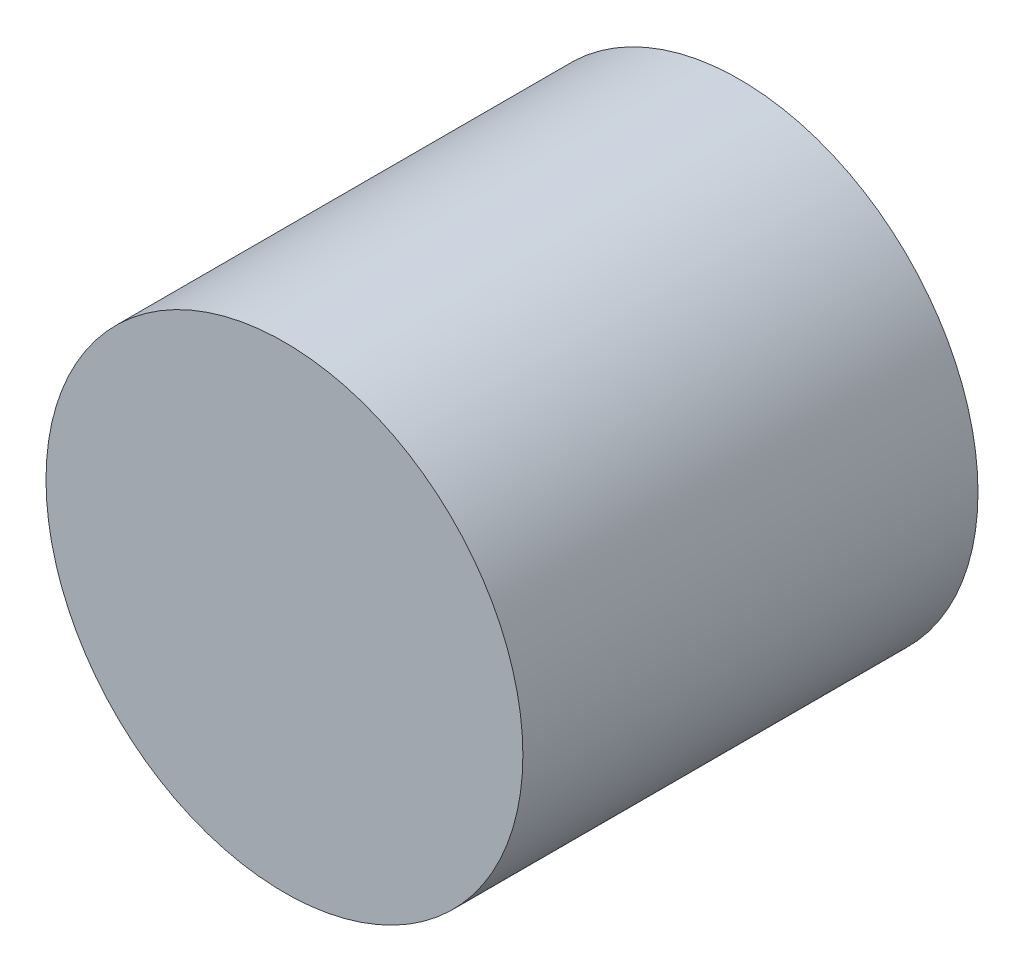
ISO-10303-21;
HEADER;
FILE_DESCRIPTION(('STEP AP214'),'2;1');
FILE_NAME('part.step','',(''),(''),'','','');
FILE_SCHEMA(('AUTOMOTIVE_DESIGN { 1 0 10303 214 1 1 1 1 }'));
ENDSEC;
DATA;
#1=APPLICATION_CONTEXT('core data for automotive mechanical design processes');
#2=APPLICATION_PROTOCOL_DEFINITION('international standard','automotive_design',2000,#1);
#3=PRODUCT_CONTEXT('',#1,'mechanical');
#4=PRODUCT('Part','Part','',(#3));
#5=PRODUCT_RELATED_PRODUCT_CATEGORY('part','',(#4));
#6=PRODUCT_DEFINITION_FORMATION('','',#4);
#7=PRODUCT_DEFINITION_CONTEXT('part definition',#1,'design');
#8=PRODUCT_DEFINITION('design','',#6,#7);
#9=PRODUCT_DEFINITION_SHAPE('','',#8);
#10=(LENGTH_UNIT() NAMED_UNIT(*) SI_UNIT(.MILLI.,.METRE.));
#11=(NAMED_UNIT(*) PLANE_ANGLE_UNIT() SI_UNIT($,.RADIAN.));
#12=(NAMED_UNIT(*) SI_UNIT($,.STERADIAN.) SOLID_ANGLE_UNIT());
#13=UNCERTAINTY_MEASURE_WITH_UNIT(LENGTH_MEASURE(1.E-05),#10,'distance_accuracy_value','');
#14=(GEOMETRIC_REPRESENTATION_CONTEXT(3) GLOBAL_UNCERTAINTY_ASSIGNED_CONTEXT((#13)) GLOBAL_UNIT_ASSIGNED_CONTEXT((#10,
#11,#12)) REPRESENTATION_CONTEXT('',''));
#15=CARTESIAN_POINT('',(0.,0.,0.));
#16=DIRECTION('',(0.,0.,1.));
#17=DIRECTION('',(1.,0.,0.));
#18=AXIS2_PLACEMENT_3D('',#15,#16,#17);
#19=CARTESIAN_POINT('',(-3.719,6.137,10.60613));
#20=DIRECTION('',(0.,0.,-1.));
#21=DIRECTION('',(-1.,0.,0.));
#22=AXIS2_PLACEMENT_3D('',#19,#20,#21);
#23=CYLINDRICAL_SURFACE('',#22,5.55651);
#24=CARTESIAN_POINT('',(-3.719,6.137,10.60613));
#25=DIRECTION('',(0.,0.,1.));
#26=DIRECTION('',(1.,0.,0.));
#27=AXIS2_PLACEMENT_3D('',#24,#25,#26);
#28=CIRCLE('',#27,5.55651);
#29=CARTESIAN_POINT('',(1.83751,6.137,10.60613));
#30=VERTEX_POINT('',#29);
#31=EDGE_CURVE('E10',#30,#30,#28,.T.);
#32=ORIENTED_EDGE('',*,*,#31,.F.);
#33=EDGE_LOOP('',(#32));
#34=FACE_BOUND('',#33,.T.);
#35=CARTESIAN_POINT('',(-3.719,6.137,0.));
#36=DIRECTION('',(0.,0.,1.));
#37=DIRECTION('',(1.,0.,0.));
#38=AXIS2_PLACEMENT_3D('',#35,#36,#37);
#39=CIRCLE('',#38,5.55651);
#40=CARTESIAN_POINT('',(1.83751,6.137,0.));
#41=VERTEX_POINT('',#40);
#42=EDGE_CURVE('E45',#41,#41,#39,.T.);
#43=ORIENTED_EDGE('',*,*,#42,.T.);
#44=EDGE_LOOP('',(#43));
#45=FACE_BOUND('',#44,.T.);
#46=ADVANCED_FACE('F39',(#34,#45),#23,.T.);
#47=CARTESIAN_POINT('',(-3.719,6.137,10.60613));
#48=DIRECTION('',(0.,0.,1.));
#49=DIRECTION('',(1.,0.,0.));
#50=AXIS2_PLACEMENT_3D('',#47,#48,#49);
#51=PLANE('',#50);
#52=ORIENTED_EDGE('',*,*,#31,.T.);
#53=EDGE_LOOP('',(#52));
#54=FACE_BOUND('',#53,.T.);
#55=ADVANCED_FACE('F53',(#54),#51,.T.);
#56=CARTESIAN_POINT('',(-3.719,6.137,0.));
#57=DIRECTION('',(0.,0.,1.));
#58=DIRECTION('',(1.,0.,0.));
#59=AXIS2_PLACEMENT_3D('',#56,#57,#58);
#60=PLANE('',#59);
#61=ORIENTED_EDGE('',*,*,#42,.F.);
#62=EDGE_LOOP('',(#61));
#63=FACE_BOUND('',#62,.T.);
#64=ADVANCED_FACE('F55',(#63),#60,.F.);
#65=CLOSED_SHELL('',(#46,#55,#64));
#66=MANIFOLD_SOLID_BREP('B2',#65);
#67=ADVANCED_BREP_SHAPE_REPRESENTATION('',(#18,#66),#14);
#68=SHAPE_DEFINITION_REPRESENTATION(#9,#67);
ENDSEC;
END-ISO-10303-21;
